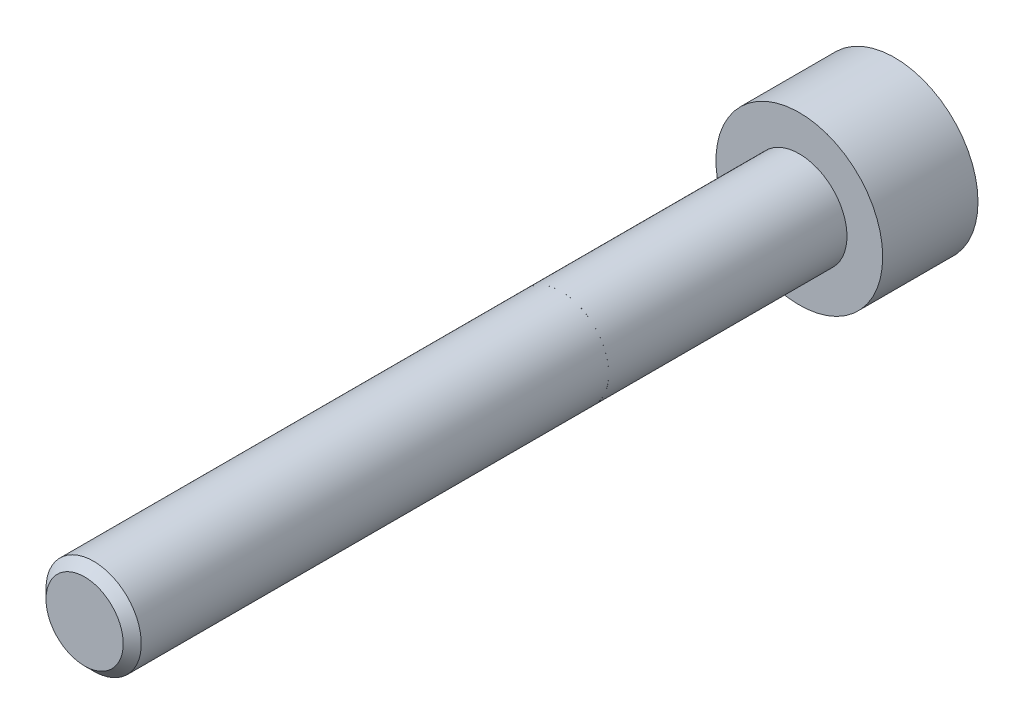
ISO-10303-21;
HEADER;
FILE_DESCRIPTION(('STEP AP214'),'2;1');
FILE_NAME('part.step','',(''),(''),'','','');
FILE_SCHEMA(('AUTOMOTIVE_DESIGN { 1 0 10303 214 1 1 1 1 }'));
ENDSEC;
DATA;
#1=APPLICATION_CONTEXT('core data for automotive mechanical design processes');
#2=APPLICATION_PROTOCOL_DEFINITION('international standard','automotive_design',2000,#1);
#3=PRODUCT_CONTEXT('',#1,'mechanical');
#4=PRODUCT('Part','Part','',(#3));
#5=PRODUCT_RELATED_PRODUCT_CATEGORY('part','',(#4));
#6=PRODUCT_DEFINITION_FORMATION('','',#4);
#7=PRODUCT_DEFINITION_CONTEXT('part definition',#1,'design');
#8=PRODUCT_DEFINITION('design','',#6,#7);
#9=PRODUCT_DEFINITION_SHAPE('','',#8);
#10=(LENGTH_UNIT() NAMED_UNIT(*) SI_UNIT(.MILLI.,.METRE.));
#11=(NAMED_UNIT(*) PLANE_ANGLE_UNIT() SI_UNIT($,.RADIAN.));
#12=(NAMED_UNIT(*) SI_UNIT($,.STERADIAN.) SOLID_ANGLE_UNIT());
#13=UNCERTAINTY_MEASURE_WITH_UNIT(LENGTH_MEASURE(1.E-05),#10,'distance_accuracy_value','');
#14=(GEOMETRIC_REPRESENTATION_CONTEXT(3) GLOBAL_UNCERTAINTY_ASSIGNED_CONTEXT((#13)) GLOBAL_UNIT_ASSIGNED_CONTEXT((#10,
#11,#12)) REPRESENTATION_CONTEXT('',''));
#15=CARTESIAN_POINT('',(0.,0.,0.));
#16=DIRECTION('',(0.,0.,1.));
#17=DIRECTION('',(1.,0.,0.));
#18=AXIS2_PLACEMENT_3D('',#15,#16,#17);
#19=CARTESIAN_POINT('',(-1.5,0.8660254037844,-2.));
#20=DIRECTION('',(-1.,0.,0.));
#21=DIRECTION('',(0.,0.,1.));
#22=AXIS2_PLACEMENT_3D('',#19,#20,#21);
#23=PLANE('',#22);
#24=DIRECTION('',(0.,0.,1.));
#25=VECTOR('',#24,1.);
#26=CARTESIAN_POINT('',(-1.5,-0.8660254037844,-2.));
#27=LINE('',#26,#25);
#28=CARTESIAN_POINT('',(-1.5,-0.866025403784398,-2.));
#29=VERTEX_POINT('',#28);
#30=CARTESIAN_POINT('',(-1.5,-0.866025403784398,-4.));
#31=VERTEX_POINT('',#30);
#32=EDGE_CURVE('P0_E81',#29,#31,#27,.F.);
#33=ORIENTED_EDGE('',*,*,#32,.T.);
#34=DIRECTION('',(0.,1.,0.));
#35=VECTOR('',#34,1.);
#36=CARTESIAN_POINT('',(-1.5,0.8660254037844,-4.));
#37=LINE('',#36,#35);
#38=CARTESIAN_POINT('',(-1.50000000000002,0.86602540378444,-4.));
#39=VERTEX_POINT('',#38);
#40=EDGE_CURVE('P0_E71',#39,#31,#37,.F.);
#41=ORIENTED_EDGE('',*,*,#40,.F.);
#42=DIRECTION('',(0.,0.,1.));
#43=VECTOR('',#42,1.);
#44=CARTESIAN_POINT('',(-1.50000000000005,0.866025403784492,-2.));
#45=LINE('',#44,#43);
#46=CARTESIAN_POINT('',(-1.50000000000002,0.86602540378444,-2.));
#47=VERTEX_POINT('',#46);
#48=EDGE_CURVE('P0_E128',#39,#47,#45,.T.);
#49=ORIENTED_EDGE('',*,*,#48,.T.);
#50=DIRECTION('',(0.,1.,0.));
#51=VECTOR('',#50,1.);
#52=CARTESIAN_POINT('',(-1.5,0.8660254037844,-2.));
#53=LINE('',#52,#51);
#54=EDGE_CURVE('P0_E67',#29,#47,#53,.T.);
#55=ORIENTED_EDGE('',*,*,#54,.F.);
#56=EDGE_LOOP('',(#33,#41,#49,#55));
#57=FACE_BOUND('',#56,.T.);
#58=ADVANCED_FACE('P0_F17',(#57),#23,.F.);
#59=CARTESIAN_POINT('',(-1.5,-0.8660254037844,-2.));
#60=DIRECTION('',(-0.500000000000017,-0.866025403784429,0.));
#61=DIRECTION('',(0.866025403784429,-0.500000000000017,0.));
#62=AXIS2_PLACEMENT_3D('',#59,#60,#61);
#63=PLANE('',#62);
#64=DIRECTION('',(0.,0.,1.));
#65=VECTOR('',#64,1.);
#66=CARTESIAN_POINT('',(0.,-1.73205080756899,-2.));
#67=LINE('',#66,#65);
#68=CARTESIAN_POINT('',(0.,-1.73205080756895,-2.));
#69=VERTEX_POINT('',#68);
#70=CARTESIAN_POINT('',(0.,-1.73205080756895,-4.));
#71=VERTEX_POINT('',#70);
#72=EDGE_CURVE('P0_E86',#69,#71,#67,.F.);
#73=ORIENTED_EDGE('',*,*,#72,.T.);
#74=DIRECTION('',(0.866025403784429,-0.500000000000017,0.));
#75=VECTOR('',#74,1.);
#76=CARTESIAN_POINT('',(-1.5,-0.8660254037844,-4.));
#77=LINE('',#76,#75);
#78=EDGE_CURVE('P0_E74',#31,#71,#77,.T.);
#79=ORIENTED_EDGE('',*,*,#78,.F.);
#80=ORIENTED_EDGE('',*,*,#32,.F.);
#81=DIRECTION('',(0.866025403784429,-0.500000000000017,0.));
#82=VECTOR('',#81,1.);
#83=CARTESIAN_POINT('',(-1.5,-0.8660254037844,-2.));
#84=LINE('',#83,#82);
#85=EDGE_CURVE('P0_E87',#69,#29,#84,.F.);
#86=ORIENTED_EDGE('',*,*,#85,.F.);
#87=EDGE_LOOP('',(#73,#79,#80,#86));
#88=FACE_BOUND('',#87,.T.);
#89=ADVANCED_FACE('P0_F84',(#88),#63,.F.);
#90=CARTESIAN_POINT('',(0.,1.732050807569,-2.));
#91=DIRECTION('',(-0.500000000000017,0.866025403784429,0.));
#92=DIRECTION('',(-0.866025403784429,-0.500000000000017,0.));
#93=AXIS2_PLACEMENT_3D('',#90,#91,#92);
#94=PLANE('',#93);
#95=ORIENTED_EDGE('',*,*,#48,.F.);
#96=DIRECTION('',(-0.866025403784429,-0.500000000000017,0.));
#97=VECTOR('',#96,1.);
#98=CARTESIAN_POINT('',(0.,1.732050807569,-4.));
#99=LINE('',#98,#97);
#100=CARTESIAN_POINT('',(0.,1.73205080756895,-4.));
#101=VERTEX_POINT('',#100);
#102=EDGE_CURVE('P0_E77',#101,#39,#99,.T.);
#103=ORIENTED_EDGE('',*,*,#102,.F.);
#104=DIRECTION('',(0.,0.,1.));
#105=VECTOR('',#104,1.);
#106=CARTESIAN_POINT('',(0.,1.73205080756891,-2.));
#107=LINE('',#106,#105);
#108=CARTESIAN_POINT('',(0.,1.73205080756897,-2.));
#109=VERTEX_POINT('',#108);
#110=EDGE_CURVE('P0_E119',#101,#109,#107,.T.);
#111=ORIENTED_EDGE('',*,*,#110,.T.);
#112=DIRECTION('',(-0.866025403784429,-0.500000000000017,0.));
#113=VECTOR('',#112,1.);
#114=CARTESIAN_POINT('',(0.,1.732050807569,-2.));
#115=LINE('',#114,#113);
#116=EDGE_CURVE('P0_E126',#47,#109,#115,.F.);
#117=ORIENTED_EDGE('',*,*,#116,.F.);
#118=EDGE_LOOP('',(#95,#103,#111,#117));
#119=FACE_BOUND('',#118,.T.);
#120=ADVANCED_FACE('P0_F131',(#119),#94,.F.);
#121=CARTESIAN_POINT('',(0.,-1.732050807569,-2.));
#122=DIRECTION('',(0.500000000000017,-0.866025403784429,0.));
#123=DIRECTION('',(0.866025403784429,0.500000000000017,0.));
#124=AXIS2_PLACEMENT_3D('',#121,#122,#123);
#125=PLANE('',#124);
#126=DIRECTION('',(0.,0.,-1.));
#127=VECTOR('',#126,1.);
#128=CARTESIAN_POINT('',(1.5,-0.866025403784446,-2.));
#129=LINE('',#128,#127);
#130=CARTESIAN_POINT('',(1.50000000000003,-0.866025403784469,-2.));
#131=VERTEX_POINT('',#130);
#132=CARTESIAN_POINT('',(1.50000000000003,-0.866025403784463,-4.));
#133=VERTEX_POINT('',#132);
#134=EDGE_CURVE('P0_E112',#131,#133,#129,.T.);
#135=ORIENTED_EDGE('',*,*,#134,.T.);
#136=DIRECTION('',(0.866025403784429,0.500000000000017,0.));
#137=VECTOR('',#136,1.);
#138=CARTESIAN_POINT('',(0.,-1.732050807569,-4.));
#139=LINE('',#138,#137);
#140=EDGE_CURVE('P0_E35',#71,#133,#139,.T.);
#141=ORIENTED_EDGE('',*,*,#140,.F.);
#142=ORIENTED_EDGE('',*,*,#72,.F.);
#143=DIRECTION('',(0.866025403784417,0.500000000000037,0.));
#144=VECTOR('',#143,1.);
#145=CARTESIAN_POINT('',(0.,-1.73205080756898,-2.));
#146=LINE('',#145,#144);
#147=EDGE_CURVE('P0_E114',#69,#131,#146,.T.);
#148=ORIENTED_EDGE('',*,*,#147,.T.);
#149=EDGE_LOOP('',(#135,#141,#142,#148));
#150=FACE_BOUND('',#149,.T.);
#151=ADVANCED_FACE('P0_F139',(#150),#125,.F.);
#152=CARTESIAN_POINT('',(1.5,0.8660254037844,-2.));
#153=DIRECTION('',(0.500000000000017,0.866025403784429,0.));
#154=DIRECTION('',(-0.866025403784429,0.500000000000017,0.));
#155=AXIS2_PLACEMENT_3D('',#152,#153,#154);
#156=PLANE('',#155);
#157=ORIENTED_EDGE('',*,*,#110,.F.);
#158=DIRECTION('',(-0.866025403784429,0.500000000000017,0.));
#159=VECTOR('',#158,1.);
#160=CARTESIAN_POINT('',(1.5,0.8660254037844,-4.));
#161=LINE('',#160,#159);
#162=CARTESIAN_POINT('',(1.5,0.866025403784398,-4.));
#163=VERTEX_POINT('',#162);
#164=EDGE_CURVE('P0_E122',#163,#101,#161,.T.);
#165=ORIENTED_EDGE('',*,*,#164,.F.);
#166=DIRECTION('',(0.,0.,-1.));
#167=VECTOR('',#166,1.);
#168=CARTESIAN_POINT('',(1.5,0.8660254037844,-2.));
#169=LINE('',#168,#167);
#170=CARTESIAN_POINT('',(1.50000000000001,0.866025403784396,-2.));
#171=VERTEX_POINT('',#170);
#172=EDGE_CURVE('P0_E107',#163,#171,#169,.F.);
#173=ORIENTED_EDGE('',*,*,#172,.T.);
#174=DIRECTION('',(-0.866025403784406,0.500000000000057,0.));
#175=VECTOR('',#174,1.);
#176=CARTESIAN_POINT('',(1.5,0.8660254037844,-2.));
#177=LINE('',#176,#175);
#178=EDGE_CURVE('P0_E116',#171,#109,#177,.T.);
#179=ORIENTED_EDGE('',*,*,#178,.T.);
#180=EDGE_LOOP('',(#157,#165,#173,#179));
#181=FACE_BOUND('',#180,.T.);
#182=ADVANCED_FACE('P0_F145',(#181),#156,.F.);
#183=CARTESIAN_POINT('',(0.,0.,-2.));
#184=DIRECTION('',(0.,0.,1.));
#185=DIRECTION('',(1.,0.,0.));
#186=AXIS2_PLACEMENT_3D('',#183,#184,#185);
#187=PLANE('',#186);
#188=ORIENTED_EDGE('',*,*,#85,.T.);
#189=ORIENTED_EDGE('',*,*,#54,.T.);
#190=ORIENTED_EDGE('',*,*,#116,.T.);
#191=ORIENTED_EDGE('',*,*,#178,.F.);
#192=DIRECTION('',(0.,1.,0.));
#193=VECTOR('',#192,1.);
#194=CARTESIAN_POINT('',(1.5,-0.8660254037844,-2.));
#195=LINE('',#194,#193);
#196=EDGE_CURVE('P0_E103',#171,#131,#195,.F.);
#197=ORIENTED_EDGE('',*,*,#196,.T.);
#198=ORIENTED_EDGE('',*,*,#147,.F.);
#199=EDGE_LOOP('',(#188,#189,#190,#191,#197,#198));
#200=FACE_BOUND('',#199,.T.);
#201=ADVANCED_FACE('P0_F135',(#200),#187,.F.);
#202=CARTESIAN_POINT('',(1.5,-0.8660254037844,-2.));
#203=DIRECTION('',(1.,0.,0.));
#204=DIRECTION('',(0.,0.,-1.));
#205=AXIS2_PLACEMENT_3D('',#202,#203,#204);
#206=PLANE('',#205);
#207=ORIENTED_EDGE('',*,*,#172,.F.);
#208=DIRECTION('',(0.,1.,0.));
#209=VECTOR('',#208,1.);
#210=CARTESIAN_POINT('',(1.50000000000001,0.,-4.));
#211=LINE('',#210,#209);
#212=EDGE_CURVE('P0_E100',#133,#163,#211,.T.);
#213=ORIENTED_EDGE('',*,*,#212,.F.);
#214=ORIENTED_EDGE('',*,*,#134,.F.);
#215=ORIENTED_EDGE('',*,*,#196,.F.);
#216=EDGE_LOOP('',(#207,#213,#214,#215));
#217=FACE_BOUND('',#216,.T.);
#218=ADVANCED_FACE('P0_F143',(#217),#206,.F.);
#219=CARTESIAN_POINT('',(0.,0.,-4.));
#220=DIRECTION('',(0.,0.,-1.));
#221=DIRECTION('',(-1.,0.,0.));
#222=AXIS2_PLACEMENT_3D('',#219,#220,#221);
#223=PLANE('',#222);
#224=CARTESIAN_POINT('',(0.,0.,-4.));
#225=DIRECTION('',(0.,0.,1.));
#226=DIRECTION('',(1.,0.,0.));
#227=AXIS2_PLACEMENT_3D('',#224,#225,#226);
#228=CIRCLE('',#227,3.5);
#229=CARTESIAN_POINT('',(3.5,0.,-4.));
#230=VERTEX_POINT('',#229);
#231=EDGE_CURVE('P0_E20',#230,#230,#228,.T.);
#232=ORIENTED_EDGE('',*,*,#231,.F.);
#233=EDGE_LOOP('',(#232));
#234=FACE_BOUND('',#233,.T.);
#235=ORIENTED_EDGE('',*,*,#140,.T.);
#236=ORIENTED_EDGE('',*,*,#212,.T.);
#237=ORIENTED_EDGE('',*,*,#164,.T.);
#238=ORIENTED_EDGE('',*,*,#102,.T.);
#239=ORIENTED_EDGE('',*,*,#40,.T.);
#240=ORIENTED_EDGE('',*,*,#78,.T.);
#241=EDGE_LOOP('',(#235,#236,#237,#238,#239,#240));
#242=FACE_BOUND('',#241,.T.);
#243=ADVANCED_FACE('P0_F72',(#234,#242),#223,.T.);
#244=CARTESIAN_POINT('',(0.,0.8105625,30.));
#245=DIRECTION('',(0.,0.,1.));
#246=DIRECTION('',(1.,0.,0.));
#247=AXIS2_PLACEMENT_3D('',#244,#245,#246);
#248=PLANE('',#247);
#249=CARTESIAN_POINT('',(0.,0.,30.0000000000296));
#250=DIRECTION('',(0.,0.,-1.));
#251=DIRECTION('',(-1.,0.,0.));
#252=AXIS2_PLACEMENT_3D('',#249,#250,#251);
#253=CIRCLE('',#252,1.62112500004241);
#254=CARTESIAN_POINT('',(-1.62112500004241,0.,30.0000000000296));
#255=VERTEX_POINT('',#254);
#256=EDGE_CURVE('P0_E95',#255,#255,#253,.T.);
#257=ORIENTED_EDGE('',*,*,#256,.F.);
#258=EDGE_LOOP('',(#257));
#259=FACE_BOUND('',#258,.T.);
#260=ADVANCED_FACE('P0_F174',(#259),#248,.T.);
#261=CARTESIAN_POINT('',(0.,0.,-2.));
#262=DIRECTION('',(0.,0.,1.));
#263=DIRECTION('',(1.,0.,0.));
#264=AXIS2_PLACEMENT_3D('',#261,#262,#263);
#265=CYLINDRICAL_SURFACE('',#264,3.5);
#266=ORIENTED_EDGE('',*,*,#231,.T.);
#267=EDGE_LOOP('',(#266));
#268=FACE_BOUND('',#267,.T.);
#269=CARTESIAN_POINT('',(0.,0.,0.));
#270=DIRECTION('',(0.,0.,1.));
#271=DIRECTION('',(1.,0.,0.));
#272=AXIS2_PLACEMENT_3D('',#269,#270,#271);
#273=CIRCLE('',#272,3.5);
#274=CARTESIAN_POINT('',(3.5,0.,0.));
#275=VERTEX_POINT('',#274);
#276=EDGE_CURVE('P0_E93',#275,#275,#273,.T.);
#277=ORIENTED_EDGE('',*,*,#276,.F.);
#278=EDGE_LOOP('',(#277));
#279=FACE_BOUND('',#278,.T.);
#280=ADVANCED_FACE('P0_F170',(#268,#279),#265,.T.);
#281=CARTESIAN_POINT('',(0.,0.,29.6211250001193));
#282=DIRECTION('',(0.,0.,-1.));
#283=DIRECTION('',(-1.,0.,0.));
#284=AXIS2_PLACEMENT_3D('',#281,#282,#283);
#285=CONICAL_SURFACE('',#284,1.99999999995271,0.785398163397448);
#286=CARTESIAN_POINT('',(0.,0.,29.621125));
#287=DIRECTION('',(0.,0.,-1.));
#288=DIRECTION('',(-1.,0.,0.));
#289=AXIS2_PLACEMENT_3D('',#286,#287,#288);
#290=CIRCLE('',#289,2.);
#291=CARTESIAN_POINT('',(-2.,0.,29.621125));
#292=VERTEX_POINT('',#291);
#293=EDGE_CURVE('P0_E26',#292,#292,#290,.T.);
#294=ORIENTED_EDGE('',*,*,#293,.F.);
#295=EDGE_LOOP('',(#294));
#296=FACE_BOUND('',#295,.T.);
#297=ORIENTED_EDGE('',*,*,#256,.T.);
#298=EDGE_LOOP('',(#297));
#299=FACE_BOUND('',#298,.T.);
#300=ADVANCED_FACE('P0_F163',(#296,#299),#285,.T.);
#301=CARTESIAN_POINT('',(0.,0.,0.));
#302=DIRECTION('',(0.,0.,1.));
#303=DIRECTION('',(1.,0.,0.));
#304=AXIS2_PLACEMENT_3D('',#301,#302,#303);
#305=PLANE('',#304);
#306=ORIENTED_EDGE('',*,*,#276,.T.);
#307=EDGE_LOOP('',(#306));
#308=FACE_BOUND('',#307,.T.);
#309=CARTESIAN_POINT('',(0.,0.,0.));
#310=DIRECTION('',(0.,0.,-1.));
#311=DIRECTION('',(-1.,0.,0.));
#312=AXIS2_PLACEMENT_3D('',#309,#310,#311);
#313=CIRCLE('',#312,2.);
#314=CARTESIAN_POINT('',(-2.,0.,0.));
#315=VERTEX_POINT('',#314);
#316=EDGE_CURVE('P0_E11',#315,#315,#313,.F.);
#317=ORIENTED_EDGE('',*,*,#316,.F.);
#318=EDGE_LOOP('',(#317));
#319=FACE_BOUND('',#318,.T.);
#320=ADVANCED_FACE('P0_F157',(#308,#319),#305,.T.);
#321=CARTESIAN_POINT('',(0.,0.,14.3105625));
#322=DIRECTION('',(0.,0.,-1.));
#323=DIRECTION('',(-1.,0.,0.));
#324=AXIS2_PLACEMENT_3D('',#321,#322,#323);
#325=CYLINDRICAL_SURFACE('',#324,2.);
#326=ORIENTED_EDGE('',*,*,#316,.T.);
#327=EDGE_LOOP('',(#326));
#328=FACE_BOUND('',#327,.T.);
#329=ORIENTED_EDGE('',*,*,#293,.T.);
#330=EDGE_LOOP('',(#329));
#331=FACE_BOUND('',#330,.T.);
#332=ADVANCED_FACE('P0_F155',(#328,#331),#325,.T.);
#333=CLOSED_SHELL('',(#58,#89,#120,#151,#182,#201,#218,#243,#260,#280,#300,#320,#332));
#334=MANIFOLD_SOLID_BREP('P0_B1',#333);
#335=CARTESIAN_POINT('',(0.,0.,30.));
#336=DIRECTION('',(0.,0.,1.));
#337=DIRECTION('',(1.,0.,0.));
#338=AXIS2_PLACEMENT_3D('',#335,#336,#337);
#339=CYLINDRICAL_SURFACE('',#338,1.6);
#340=CARTESIAN_POINT('',(0.,0.,30.));
#341=DIRECTION('',(0.,0.,1.));
#342=DIRECTION('',(1.,0.,0.));
#343=AXIS2_PLACEMENT_3D('',#340,#341,#342);
#344=CIRCLE('',#343,1.6);
#345=CARTESIAN_POINT('',(1.6,0.,30.));
#346=VERTEX_POINT('',#345);
#347=EDGE_CURVE('P1_E11',#346,#346,#344,.F.);
#348=ORIENTED_EDGE('',*,*,#347,.T.);
#349=EDGE_LOOP('',(#348));
#350=FACE_BOUND('',#349,.T.);
#351=CARTESIAN_POINT('',(0.,0.,10.));
#352=DIRECTION('',(0.,0.,1.));
#353=DIRECTION('',(1.,0.,0.));
#354=AXIS2_PLACEMENT_3D('',#351,#352,#353);
#355=CIRCLE('',#354,1.6);
#356=CARTESIAN_POINT('',(1.6,0.,10.));
#357=VERTEX_POINT('',#356);
#358=EDGE_CURVE('P1_E21',#357,#357,#355,.T.);
#359=ORIENTED_EDGE('',*,*,#358,.T.);
#360=EDGE_LOOP('',(#359));
#361=FACE_BOUND('',#360,.T.);
#362=ADVANCED_FACE('P1_F17',(#350,#361),#339,.T.);
#363=CARTESIAN_POINT('',(0.,0.,10.));
#364=DIRECTION('',(0.,0.,1.));
#365=DIRECTION('',(1.,0.,0.));
#366=AXIS2_PLACEMENT_3D('',#363,#364,#365);
#367=PLANE('',#366);
#368=CARTESIAN_POINT('',(-2.,0.,10.));
#369=CARTESIAN_POINT('',(-1.99869337305356,-0.399845605461818,10.));
#370=CARTESIAN_POINT('',(-1.84778024992828,-0.765197024036736,10.));
#371=CARTESIAN_POINT('',(-1.69640686272512,-1.13166271372531,10.));
#372=CARTESIAN_POINT('',(-1.4142079396968,-1.41418152239547,10.));
#373=CARTESIAN_POINT('',(-1.13372725024788,-1.69498014978832,10.));
#374=CARTESIAN_POINT('',(-0.765365118905268,-1.84775021503496,10.));
#375=CARTESIAN_POINT('',(-0.398771348802724,-1.9997868914801,10.));
#376=CARTESIAN_POINT('',(0.,-1.99999999999966,10.));
#377=CARTESIAN_POINT('',(0.396636088414946,-2.0002119674087,10.));
#378=CARTESIAN_POINT('',(0.765365118905269,-1.84775021503496,10.));
#379=CARTESIAN_POINT('',(1.1319217942274,-1.69618668614875,10.));
#380=CARTESIAN_POINT('',(1.4142079396968,-1.41418152239547,10.));
#381=CARTESIAN_POINT('',(1.69520104478288,-1.13346811196019,10.));
#382=CARTESIAN_POINT('',(1.84778024992825,-0.76519702403679,10.));
#383=CARTESIAN_POINT('',(1.99868974442705,-0.400956014496266,10.));
#384=CARTESIAN_POINT('',(2.,0.,10.));
#385=B_SPLINE_CURVE_WITH_KNOTS('',2,(#368,#369,#370,#371,#372,#373,#374,#375,#376,#377,#378,
#379,#380,#381,#382,#383,#384),.UNSPECIFIED.,.F.,.F.,(3,2,2,2,2,2,2,2,3),(0.,0.125,0.25,0.375,
0.5,0.625,0.75,0.875,1.),.UNSPECIFIED.);
#386=CARTESIAN_POINT('',(-2.,0.,10.));
#387=VERTEX_POINT('',#386);
#388=CARTESIAN_POINT('',(2.,0.,10.));
#389=VERTEX_POINT('',#388);
#390=EDGE_CURVE('P1_E32',#387,#389,#385,.T.);
#391=ORIENTED_EDGE('',*,*,#390,.T.);
#392=CARTESIAN_POINT('',(2.,0.,10.));
#393=CARTESIAN_POINT('',(1.99869337305356,0.399845605461818,10.));
#394=CARTESIAN_POINT('',(1.84778024992828,0.765197024036736,10.));
#395=CARTESIAN_POINT('',(1.69640686272512,1.13166271372531,10.));
#396=CARTESIAN_POINT('',(1.4142079396968,1.41418152239547,10.));
#397=CARTESIAN_POINT('',(1.13372725024788,1.69498014978832,10.));
#398=CARTESIAN_POINT('',(0.765365118905268,1.84775021503496,10.));
#399=CARTESIAN_POINT('',(0.398771348802724,1.9997868914801,10.));
#400=CARTESIAN_POINT('',(0.,1.99999999999966,10.));
#401=CARTESIAN_POINT('',(-0.396636088414946,2.0002119674087,10.));
#402=CARTESIAN_POINT('',(-0.765365118905269,1.84775021503496,10.));
#403=CARTESIAN_POINT('',(-1.1319217942274,1.69618668614875,10.));
#404=CARTESIAN_POINT('',(-1.4142079396968,1.41418152239547,10.));
#405=CARTESIAN_POINT('',(-1.69520104478288,1.13346811196019,10.));
#406=CARTESIAN_POINT('',(-1.84778024992825,0.76519702403679,10.));
#407=CARTESIAN_POINT('',(-1.99868974442705,0.400956014496266,10.));
#408=CARTESIAN_POINT('',(-2.,0.,10.));
#409=B_SPLINE_CURVE_WITH_KNOTS('',2,(#392,#393,#394,#395,#396,#397,#398,#399,#400,#401,#402,
#403,#404,#405,#406,#407,#408),.UNSPECIFIED.,.F.,.F.,(3,2,2,2,2,2,2,2,3),(0.,0.125,0.25,0.375,
0.5,0.625,0.75,0.875,1.),.UNSPECIFIED.);
#410=EDGE_CURVE('P1_E35',#389,#387,#409,.T.);
#411=ORIENTED_EDGE('',*,*,#410,.T.);
#412=EDGE_LOOP('',(#391,#411));
#413=FACE_BOUND('',#412,.T.);
#414=ORIENTED_EDGE('',*,*,#358,.F.);
#415=EDGE_LOOP('',(#414));
#416=FACE_BOUND('',#415,.T.);
#417=ADVANCED_FACE('P1_F18',(#413,#416),#367,.T.);
#418=OPEN_SHELL('',(#362,#417));
#419=SHELL_BASED_SURFACE_MODEL('P1_B1',(#418));
#420=ADVANCED_BREP_SHAPE_REPRESENTATION('',(#18,#334),#14);
#421=MANIFOLD_SURFACE_SHAPE_REPRESENTATION('',(#18,#419),#14);
#422=SHAPE_REPRESENTATION('',(#18),#14);
#423=SHAPE_DEFINITION_REPRESENTATION(#9,#422);
#424=SHAPE_REPRESENTATION_RELATIONSHIP('','',#422,#420);
#425=SHAPE_REPRESENTATION_RELATIONSHIP('','',#422,#421);
ENDSEC;
END-ISO-10303-21;
